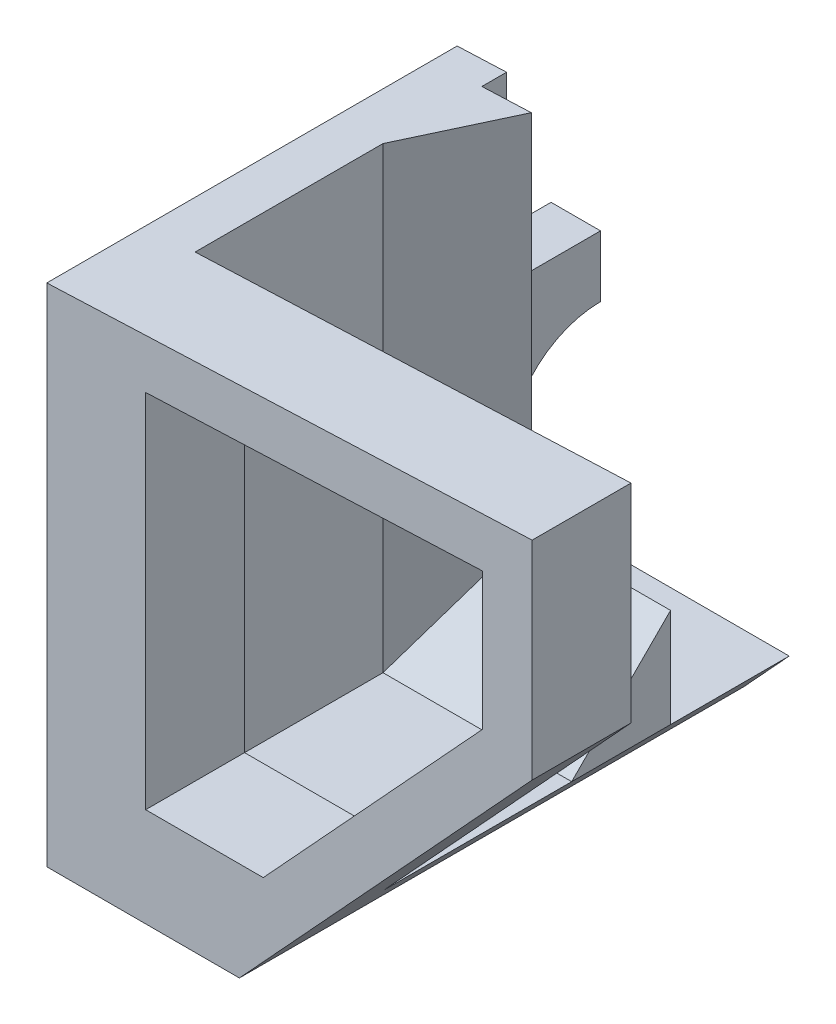
ISO-10303-21;
HEADER;
FILE_DESCRIPTION(('STEP AP214'),'2;1');
FILE_NAME('part.step','',(''),(''),'','','');
FILE_SCHEMA(('AUTOMOTIVE_DESIGN { 1 0 10303 214 1 1 1 1 }'));
ENDSEC;
DATA;
#1=APPLICATION_CONTEXT('core data for automotive mechanical design processes');
#2=APPLICATION_PROTOCOL_DEFINITION('international standard','automotive_design',2000,#1);
#3=PRODUCT_CONTEXT('',#1,'mechanical');
#4=PRODUCT('Part','Part','',(#3));
#5=PRODUCT_RELATED_PRODUCT_CATEGORY('part','',(#4));
#6=PRODUCT_DEFINITION_FORMATION('','',#4);
#7=PRODUCT_DEFINITION_CONTEXT('part definition',#1,'design');
#8=PRODUCT_DEFINITION('design','',#6,#7);
#9=PRODUCT_DEFINITION_SHAPE('','',#8);
#10=(LENGTH_UNIT() NAMED_UNIT(*) SI_UNIT(.MILLI.,.METRE.));
#11=(NAMED_UNIT(*) PLANE_ANGLE_UNIT() SI_UNIT($,.RADIAN.));
#12=(NAMED_UNIT(*) SI_UNIT($,.STERADIAN.) SOLID_ANGLE_UNIT());
#13=UNCERTAINTY_MEASURE_WITH_UNIT(LENGTH_MEASURE(1.E-05),#10,'distance_accuracy_value','');
#14=(GEOMETRIC_REPRESENTATION_CONTEXT(3) GLOBAL_UNCERTAINTY_ASSIGNED_CONTEXT((#13)) GLOBAL_UNIT_ASSIGNED_CONTEXT((#10,
#11,#12)) REPRESENTATION_CONTEXT('',''));
#15=CARTESIAN_POINT('',(0.,0.,0.));
#16=DIRECTION('',(0.,0.,1.));
#17=DIRECTION('',(1.,0.,0.));
#18=AXIS2_PLACEMENT_3D('',#15,#16,#17);
#19=CARTESIAN_POINT('',(0.,0.,-41.));
#20=DIRECTION('',(-1.,0.,0.));
#21=DIRECTION('',(0.,-1.,0.));
#22=AXIS2_PLACEMENT_3D('',#19,#20,#21);
#23=PLANE('',#22);
#24=DIRECTION('',(0.,-1.,0.));
#25=VECTOR('',#24,1.);
#26=CARTESIAN_POINT('',(0.,0.,-29.));
#27=LINE('',#26,#25);
#28=CARTESIAN_POINT('',(0.,0.,-29.));
#29=VERTEX_POINT('',#28);
#30=CARTESIAN_POINT('',(0.,-46.3445596055904,-29.));
#31=VERTEX_POINT('',#30);
#32=EDGE_CURVE('E263',#29,#31,#27,.T.);
#33=ORIENTED_EDGE('',*,*,#32,.T.);
#34=DIRECTION('',(0.,0.,1.));
#35=VECTOR('',#34,1.);
#36=CARTESIAN_POINT('',(0.,-46.3445596055904,-41.));
#37=LINE('',#36,#35);
#38=CARTESIAN_POINT('',(0.,-46.3445596055904,-41.));
#39=VERTEX_POINT('',#38);
#40=EDGE_CURVE('E207',#39,#31,#37,.T.);
#41=ORIENTED_EDGE('',*,*,#40,.F.);
#42=DIRECTION('',(0.,-1.,0.));
#43=VECTOR('',#42,1.);
#44=CARTESIAN_POINT('',(0.,0.,-41.));
#45=LINE('',#44,#43);
#46=CARTESIAN_POINT('',(0.,-43.8445596055905,-41.));
#47=VERTEX_POINT('',#46);
#48=EDGE_CURVE('E334',#47,#39,#45,.T.);
#49=ORIENTED_EDGE('',*,*,#48,.F.);
#50=CARTESIAN_POINT('',(0.,-34.3445596055904,-41.));
#51=DIRECTION('',(1.,0.,0.));
#52=DIRECTION('',(0.,1.,0.));
#53=AXIS2_PLACEMENT_3D('',#50,#51,#52);
#54=CIRCLE('',#53,9.5);
#55=CARTESIAN_POINT('',(0.,-24.8445596055904,-41.));
#56=VERTEX_POINT('',#55);
#57=EDGE_CURVE('E313',#56,#47,#54,.T.);
#58=ORIENTED_EDGE('',*,*,#57,.F.);
#59=CARTESIAN_POINT('',(0.,-18.6445596055905,-41.));
#60=VERTEX_POINT('',#59);
#61=EDGE_CURVE('E336',#60,#56,#45,.T.);
#62=ORIENTED_EDGE('',*,*,#61,.F.);
#63=DIRECTION('',(0.,0.,-1.));
#64=VECTOR('',#63,1.);
#65=CARTESIAN_POINT('',(0.,-18.6445596055905,-41.));
#66=LINE('',#65,#64);
#67=CARTESIAN_POINT('',(0.,-18.6445596055905,-31.5));
#68=VERTEX_POINT('',#67);
#69=EDGE_CURVE('E325',#68,#60,#66,.T.);
#70=ORIENTED_EDGE('',*,*,#69,.F.);
#71=DIRECTION('',(0.,-1.,0.));
#72=VECTOR('',#71,1.);
#73=CARTESIAN_POINT('',(0.,0.,-31.5));
#74=LINE('',#73,#72);
#75=CARTESIAN_POINT('',(0.,0.,-31.5));
#76=VERTEX_POINT('',#75);
#77=EDGE_CURVE('E322',#76,#68,#74,.T.);
#78=ORIENTED_EDGE('',*,*,#77,.F.);
#79=DIRECTION('',(0.,0.,1.));
#80=VECTOR('',#79,1.);
#81=CARTESIAN_POINT('',(0.,0.,-41.));
#82=LINE('',#81,#80);
#83=EDGE_CURVE('E218',#76,#29,#82,.T.);
#84=ORIENTED_EDGE('',*,*,#83,.T.);
#85=EDGE_LOOP('',(#33,#41,#49,#58,#62,#70,#78,#84));
#86=FACE_BOUND('',#85,.T.);
#87=ADVANCED_FACE('F35',(#86),#23,.F.);
#88=CARTESIAN_POINT('',(0.,-46.3445596055904,-41.));
#89=DIRECTION('',(0.,1.,0.));
#90=DIRECTION('',(-1.,0.,0.));
#91=AXIS2_PLACEMENT_3D('',#88,#89,#90);
#92=PLANE('',#91);
#93=ORIENTED_EDGE('',*,*,#40,.T.);
#94=DIRECTION('',(1.,0.,0.));
#95=VECTOR('',#94,1.);
#96=CARTESIAN_POINT('',(19.0837304644437,-46.3445596055905,-29.));
#97=LINE('',#96,#95);
#98=CARTESIAN_POINT('',(19.0837304644437,-46.3445596055905,-29.));
#99=VERTEX_POINT('',#98);
#100=EDGE_CURVE('E185',#31,#99,#97,.T.);
#101=ORIENTED_EDGE('',*,*,#100,.T.);
#102=DIRECTION('',(0.,0.,1.));
#103=VECTOR('',#102,1.);
#104=CARTESIAN_POINT('',(19.0837304644437,-46.3445596055905,-41.));
#105=LINE('',#104,#103);
#106=CARTESIAN_POINT('',(19.0837304644437,-46.3445596055905,-41.));
#107=VERTEX_POINT('',#106);
#108=EDGE_CURVE('E208',#107,#99,#105,.T.);
#109=ORIENTED_EDGE('',*,*,#108,.F.);
#110=DIRECTION('',(-1.,0.,0.));
#111=VECTOR('',#110,1.);
#112=CARTESIAN_POINT('',(0.,-46.3445596055904,-41.));
#113=LINE('',#112,#111);
#114=EDGE_CURVE('E347',#107,#39,#113,.T.);
#115=ORIENTED_EDGE('',*,*,#114,.T.);
#116=EDGE_LOOP('',(#93,#101,#109,#115));
#117=FACE_BOUND('',#116,.T.);
#118=ADVANCED_FACE('F360',(#117),#92,.T.);
#119=CARTESIAN_POINT('',(0.,0.,-41.));
#120=DIRECTION('',(0.,0.,1.));
#121=DIRECTION('',(1.,0.,0.));
#122=AXIS2_PLACEMENT_3D('',#119,#120,#121);
#123=PLANE('',#122);
#124=DIRECTION('',(0.,1.,0.));
#125=VECTOR('',#124,1.);
#126=CARTESIAN_POINT('',(-4.99999999999999,0.,-41.));
#127=LINE('',#126,#125);
#128=CARTESIAN_POINT('',(-4.99999999999999,-51.3445596055904,-41.));
#129=VERTEX_POINT('',#128);
#130=CARTESIAN_POINT('',(-4.99999999999999,-43.8445596055905,-41.));
#131=VERTEX_POINT('',#130);
#132=EDGE_CURVE('E337',#129,#131,#127,.T.);
#133=ORIENTED_EDGE('',*,*,#132,.T.);
#134=DIRECTION('',(1.,0.,0.));
#135=VECTOR('',#134,1.);
#136=CARTESIAN_POINT('',(-5.001,-43.8445596055905,-41.));
#137=LINE('',#136,#135);
#138=EDGE_CURVE('E310',#47,#131,#137,.F.);
#139=ORIENTED_EDGE('',*,*,#138,.F.);
#140=ORIENTED_EDGE('',*,*,#48,.T.);
#141=ORIENTED_EDGE('',*,*,#114,.F.);
#142=DIRECTION('',(-0.677520829933806,-0.735503585991127,0.));
#143=VECTOR('',#142,1.);
#144=CARTESIAN_POINT('',(33.4180148678653,-30.7835360687004,-41.));
#145=LINE('',#144,#143);
#146=CARTESIAN_POINT('',(14.4779009155584,-51.3445596055904,-41.));
#147=VERTEX_POINT('',#146);
#148=EDGE_CURVE('E344',#107,#147,#145,.T.);
#149=ORIENTED_EDGE('',*,*,#148,.T.);
#150=DIRECTION('',(1.,0.,0.));
#151=VECTOR('',#150,1.);
#152=CARTESIAN_POINT('',(0.,-51.3445596055904,-41.));
#153=LINE('',#152,#151);
#154=EDGE_CURVE('E340',#129,#147,#153,.T.);
#155=ORIENTED_EDGE('',*,*,#154,.F.);
#156=EDGE_LOOP('',(#133,#139,#140,#141,#149,#155));
#157=FACE_BOUND('',#156,.T.);
#158=ADVANCED_FACE('F387',(#157),#123,.F.);
#159=CARTESIAN_POINT('',(-4.99999999999999,-51.3445596055904,10.));
#160=DIRECTION('',(-1.,0.,0.));
#161=DIRECTION('',(0.,0.,1.));
#162=AXIS2_PLACEMENT_3D('',#159,#160,#161);
#163=PLANE('',#162);
#164=CARTESIAN_POINT('',(-4.99999999999999,-34.3445596055904,-41.));
#165=DIRECTION('',(-1.,0.,0.));
#166=DIRECTION('',(0.,0.,1.));
#167=AXIS2_PLACEMENT_3D('',#164,#165,#166);
#168=CIRCLE('',#167,9.5);
#169=CARTESIAN_POINT('',(-4.99999999999999,-24.8445596055904,-41.));
#170=VERTEX_POINT('',#169);
#171=EDGE_CURVE('E315',#170,#131,#168,.F.);
#172=ORIENTED_EDGE('',*,*,#171,.T.);
#173=ORIENTED_EDGE('',*,*,#132,.F.);
#174=DIRECTION('',(0.,0.,-1.));
#175=VECTOR('',#174,1.);
#176=CARTESIAN_POINT('',(-4.99999999999999,-51.3445596055904,10.));
#177=LINE('',#176,#175);
#178=CARTESIAN_POINT('',(-4.99999999999999,-51.3445596055904,10.));
#179=VERTEX_POINT('',#178);
#180=EDGE_CURVE('E242',#179,#129,#177,.T.);
#181=ORIENTED_EDGE('',*,*,#180,.F.);
#182=DIRECTION('',(0.,1.,0.));
#183=VECTOR('',#182,1.);
#184=CARTESIAN_POINT('',(-4.99999999999999,-51.3445596055904,10.));
#185=LINE('',#184,#183);
#186=CARTESIAN_POINT('',(-4.99999999999999,-0.205172520034776,10.));
#187=VERTEX_POINT('',#186);
#188=EDGE_CURVE('E222',#179,#187,#185,.T.);
#189=ORIENTED_EDGE('',*,*,#188,.T.);
#190=DIRECTION('',(0.,0.,-1.));
#191=VECTOR('',#190,1.);
#192=CARTESIAN_POINT('',(-4.99999999999999,-0.205172520034776,10.));
#193=LINE('',#192,#191);
#194=CARTESIAN_POINT('',(-4.99999999999999,-0.205172520034776,-31.5));
#195=VERTEX_POINT('',#194);
#196=EDGE_CURVE('E235',#187,#195,#193,.T.);
#197=ORIENTED_EDGE('',*,*,#196,.T.);
#198=DIRECTION('',(0.,-1.,0.));
#199=VECTOR('',#198,1.);
#200=CARTESIAN_POINT('',(-4.99999999999999,0.,-31.5));
#201=LINE('',#200,#199);
#202=CARTESIAN_POINT('',(-4.99999999999999,-18.6445596055905,-31.5));
#203=VERTEX_POINT('',#202);
#204=EDGE_CURVE('E311',#195,#203,#201,.T.);
#205=ORIENTED_EDGE('',*,*,#204,.T.);
#206=DIRECTION('',(0.,0.,-1.));
#207=VECTOR('',#206,1.);
#208=CARTESIAN_POINT('',(-4.99999999999999,-18.6445596055905,-41.));
#209=LINE('',#208,#207);
#210=CARTESIAN_POINT('',(-4.99999999999999,-18.6445596055905,-41.));
#211=VERTEX_POINT('',#210);
#212=EDGE_CURVE('E319',#203,#211,#209,.T.);
#213=ORIENTED_EDGE('',*,*,#212,.T.);
#214=EDGE_CURVE('E341',#170,#211,#127,.T.);
#215=ORIENTED_EDGE('',*,*,#214,.F.);
#216=EDGE_LOOP('',(#172,#173,#181,#189,#197,#205,#213,#215));
#217=FACE_BOUND('',#216,.T.);
#218=ADVANCED_FACE('F391',(#217),#163,.T.);
#219=CARTESIAN_POINT('',(-4.99999999999999,-51.3445596055904,10.));
#220=DIRECTION('',(0.,1.,0.));
#221=DIRECTION('',(-1.,0.,0.));
#222=AXIS2_PLACEMENT_3D('',#219,#220,#221);
#223=PLANE('',#222);
#224=ORIENTED_EDGE('',*,*,#180,.T.);
#225=ORIENTED_EDGE('',*,*,#154,.T.);
#226=DIRECTION('',(0.,0.,-1.));
#227=VECTOR('',#226,1.);
#228=CARTESIAN_POINT('',(14.4779009155584,-51.3445596055904,10.));
#229=LINE('',#228,#227);
#230=CARTESIAN_POINT('',(14.4779009155584,-51.3445596055904,10.));
#231=VERTEX_POINT('',#230);
#232=EDGE_CURVE('E244',#231,#147,#229,.T.);
#233=ORIENTED_EDGE('',*,*,#232,.F.);
#234=DIRECTION('',(1.,0.,0.));
#235=VECTOR('',#234,1.);
#236=CARTESIAN_POINT('',(-4.99999999999999,-51.3445596055904,10.));
#237=LINE('',#236,#235);
#238=EDGE_CURVE('E233',#179,#231,#237,.T.);
#239=ORIENTED_EDGE('',*,*,#238,.F.);
#240=EDGE_LOOP('',(#224,#225,#233,#239));
#241=FACE_BOUND('',#240,.T.);
#242=ADVANCED_FACE('F388',(#241),#223,.F.);
#243=CARTESIAN_POINT('',(44.0837304644437,-19.2050402913656,10.));
#244=DIRECTION('',(0.735503585991127,-0.677520829933806,0.));
#245=DIRECTION('',(0.677520829933806,0.735503585991127,0.));
#246=AXIS2_PLACEMENT_3D('',#243,#244,#245);
#247=PLANE('',#246);
#248=DIRECTION('',(-0.677520829933806,-0.735503585991127,0.));
#249=VECTOR('',#248,1.);
#250=CARTESIAN_POINT('',(44.0837304644437,-19.2050402913656,0.));
#251=LINE('',#250,#249);
#252=CARTESIAN_POINT('',(44.0837304644437,-19.2050402913656,0.));
#253=VERTEX_POINT('',#252);
#254=CARTESIAN_POINT('',(19.0837304644437,-46.3445596055905,0.));
#255=VERTEX_POINT('',#254);
#256=EDGE_CURVE('E226',#253,#255,#251,.T.);
#257=ORIENTED_EDGE('',*,*,#256,.F.);
#258=DIRECTION('',(0.,0.,-1.));
#259=VECTOR('',#258,1.);
#260=CARTESIAN_POINT('',(44.0837304644437,-19.2050402913656,10.));
#261=LINE('',#260,#259);
#262=CARTESIAN_POINT('',(44.0837304644437,-19.2050402913656,10.));
#263=VERTEX_POINT('',#262);
#264=EDGE_CURVE('E246',#263,#253,#261,.T.);
#265=ORIENTED_EDGE('',*,*,#264,.F.);
#266=DIRECTION('',(-0.677520829933806,-0.735503585991127,0.));
#267=VECTOR('',#266,1.);
#268=CARTESIAN_POINT('',(44.0837304644437,-19.2050402913656,10.));
#269=LINE('',#268,#267);
#270=EDGE_CURVE('E230',#263,#231,#269,.T.);
#271=ORIENTED_EDGE('',*,*,#270,.T.);
#272=ORIENTED_EDGE('',*,*,#232,.T.);
#273=ORIENTED_EDGE('',*,*,#148,.F.);
#274=ORIENTED_EDGE('',*,*,#108,.T.);
#275=DIRECTION('',(0.,0.,-1.));
#276=VECTOR('',#275,1.);
#277=CARTESIAN_POINT('',(19.0837304644437,-46.3445596055905,-19.));
#278=LINE('',#277,#276);
#279=CARTESIAN_POINT('',(19.0837304644437,-46.3445596055905,-19.));
#280=VERTEX_POINT('',#279);
#281=EDGE_CURVE('E201',#280,#99,#278,.T.);
#282=ORIENTED_EDGE('',*,*,#281,.F.);
#283=EDGE_CURVE('E199',#280,#255,#105,.T.);
#284=ORIENTED_EDGE('',*,*,#283,.T.);
#285=EDGE_LOOP('',(#257,#265,#271,#272,#273,#274,#282,#284));
#286=FACE_BOUND('',#285,.T.);
#287=ADVANCED_FACE('F355',(#286),#247,.T.);
#288=CARTESIAN_POINT('',(44.0837304644437,-19.2050402913656,10.));
#289=DIRECTION('',(-1.,0.,0.));
#290=DIRECTION('',(0.,0.,1.));
#291=AXIS2_PLACEMENT_3D('',#288,#289,#290);
#292=PLANE('',#291);
#293=DIRECTION('',(0.,1.,0.));
#294=VECTOR('',#293,1.);
#295=CARTESIAN_POINT('',(44.0837304644437,-19.2050402913656,0.));
#296=LINE('',#295,#294);
#297=CARTESIAN_POINT('',(44.0837304644437,1.80895401438478,0.));
#298=VERTEX_POINT('',#297);
#299=EDGE_CURVE('E238',#253,#298,#296,.T.);
#300=ORIENTED_EDGE('',*,*,#299,.T.);
#301=DIRECTION('',(0.,0.,-1.));
#302=VECTOR('',#301,1.);
#303=CARTESIAN_POINT('',(44.0837304644437,1.80895401438478,10.));
#304=LINE('',#303,#302);
#305=CARTESIAN_POINT('',(44.0837304644437,1.80895401438478,10.));
#306=VERTEX_POINT('',#305);
#307=EDGE_CURVE('E248',#306,#298,#304,.T.);
#308=ORIENTED_EDGE('',*,*,#307,.F.);
#309=DIRECTION('',(0.,1.,0.));
#310=VECTOR('',#309,1.);
#311=CARTESIAN_POINT('',(44.0837304644437,-19.2050402913656,10.));
#312=LINE('',#311,#310);
#313=EDGE_CURVE('E228',#263,#306,#312,.T.);
#314=ORIENTED_EDGE('',*,*,#313,.F.);
#315=ORIENTED_EDGE('',*,*,#264,.T.);
#316=EDGE_LOOP('',(#300,#308,#314,#315));
#317=FACE_BOUND('',#316,.T.);
#318=ADVANCED_FACE('F377',(#317),#292,.F.);
#319=CARTESIAN_POINT('',(44.0837304644437,1.80895401438478,10.));
#320=DIRECTION('',(0.0409999999999302,-0.999159146482684,0.));
#321=DIRECTION('',(0.999159146482684,0.0409999999999302,0.));
#322=AXIS2_PLACEMENT_3D('',#319,#320,#321);
#323=PLANE('',#322);
#324=CARTESIAN_POINT('',(0.,0.,-19.));
#325=VERTEX_POINT('',#324);
#326=CARTESIAN_POINT('',(0.,0.,0.));
#327=VERTEX_POINT('',#326);
#328=EDGE_CURVE('E221',#325,#327,#82,.T.);
#329=ORIENTED_EDGE('',*,*,#328,.F.);
#330=DIRECTION('',(0.447138311324226,0.0183480988276974,-0.894276622648456));
#331=VECTOR('',#330,1.);
#332=CARTESIAN_POINT('',(0.,0.,-19.));
#333=LINE('',#332,#331);
#334=CARTESIAN_POINT('',(5.,0.205172520034783,-29.));
#335=VERTEX_POINT('',#334);
#336=EDGE_CURVE('E175',#325,#335,#333,.T.);
#337=ORIENTED_EDGE('',*,*,#336,.T.);
#338=DIRECTION('',(-0.999159146482684,-0.0409999999999303,0.));
#339=VECTOR('',#338,1.);
#340=CARTESIAN_POINT('',(0.,0.,-29.));
#341=LINE('',#340,#339);
#342=EDGE_CURVE('E261',#335,#29,#341,.T.);
#343=ORIENTED_EDGE('',*,*,#342,.T.);
#344=ORIENTED_EDGE('',*,*,#83,.F.);
#345=DIRECTION('',(0.999159146482684,0.0409999999999302,0.));
#346=VECTOR('',#345,1.);
#347=CARTESIAN_POINT('',(-4.99259331900003,-0.204868590553604,-31.5));
#348=LINE('',#347,#346);
#349=EDGE_CURVE('E307',#195,#76,#348,.T.);
#350=ORIENTED_EDGE('',*,*,#349,.F.);
#351=ORIENTED_EDGE('',*,*,#196,.F.);
#352=DIRECTION('',(-0.999159146482684,-0.0409999999999302,0.));
#353=VECTOR('',#352,1.);
#354=CARTESIAN_POINT('',(44.0837304644437,1.80895401438478,10.));
#355=LINE('',#354,#353);
#356=EDGE_CURVE('E225',#306,#187,#355,.T.);
#357=ORIENTED_EDGE('',*,*,#356,.F.);
#358=ORIENTED_EDGE('',*,*,#307,.T.);
#359=DIRECTION('',(-0.999159146482684,-0.0409999999999302,0.));
#360=VECTOR('',#359,1.);
#361=CARTESIAN_POINT('',(44.0837304644437,1.80895401438478,0.));
#362=LINE('',#361,#360);
#363=EDGE_CURVE('E211',#298,#327,#362,.T.);
#364=ORIENTED_EDGE('',*,*,#363,.T.);
#365=EDGE_LOOP('',(#329,#337,#343,#344,#350,#351,#357,#358,#364));
#366=FACE_BOUND('',#365,.T.);
#367=ADVANCED_FACE('F372',(#366),#323,.F.);
#368=CARTESIAN_POINT('',(0.,0.,10.));
#369=DIRECTION('',(0.,0.,-1.));
#370=DIRECTION('',(-1.,0.,0.));
#371=AXIS2_PLACEMENT_3D('',#368,#369,#370);
#372=PLANE('',#371);
#373=DIRECTION('',(-0.999159146482684,-0.0409999999999302,0.));
#374=VECTOR('',#373,1.);
#375=CARTESIAN_POINT('',(5.,-4.79903528570005,10.));
#376=LINE('',#375,#374);
#377=CARTESIAN_POINT('',(39.0837304644437,-3.40042631138484,10.));
#378=VERTEX_POINT('',#377);
#379=CARTESIAN_POINT('',(5.,-4.79903528570005,10.));
#380=VERTEX_POINT('',#379);
#381=EDGE_CURVE('E273',#378,#380,#376,.T.);
#382=ORIENTED_EDGE('',*,*,#381,.F.);
#383=DIRECTION('',(0.,1.,0.));
#384=VECTOR('',#383,1.);
#385=CARTESIAN_POINT('',(39.0837304644437,-3.40042631138484,10.));
#386=LINE('',#385,#384);
#387=CARTESIAN_POINT('',(39.0837304644437,-17.253097249004,10.));
#388=VERTEX_POINT('',#387);
#389=EDGE_CURVE('E276',#388,#378,#386,.T.);
#390=ORIENTED_EDGE('',*,*,#389,.F.);
#391=DIRECTION('',(0.677520829933806,0.735503585991127,0.));
#392=VECTOR('',#391,1.);
#393=CARTESIAN_POINT('',(39.0837304644437,-17.253097249004,10.));
#394=LINE('',#393,#392);
#395=CARTESIAN_POINT('',(16.891496624879,-41.3445596055905,10.));
#396=VERTEX_POINT('',#395);
#397=EDGE_CURVE('E296',#396,#388,#394,.T.);
#398=ORIENTED_EDGE('',*,*,#397,.F.);
#399=DIRECTION('',(1.,0.,0.));
#400=VECTOR('',#399,1.);
#401=CARTESIAN_POINT('',(16.891496624879,-41.3445596055905,10.));
#402=LINE('',#401,#400);
#403=CARTESIAN_POINT('',(5.,-41.3445596055904,10.));
#404=VERTEX_POINT('',#403);
#405=EDGE_CURVE('E268',#404,#396,#402,.T.);
#406=ORIENTED_EDGE('',*,*,#405,.F.);
#407=DIRECTION('',(0.,-1.,0.));
#408=VECTOR('',#407,1.);
#409=CARTESIAN_POINT('',(5.,-41.3445596055904,10.));
#410=LINE('',#409,#408);
#411=EDGE_CURVE('E270',#380,#404,#410,.T.);
#412=ORIENTED_EDGE('',*,*,#411,.F.);
#413=EDGE_LOOP('',(#382,#390,#398,#406,#412));
#414=FACE_BOUND('',#413,.T.);
#415=ORIENTED_EDGE('',*,*,#188,.F.);
#416=ORIENTED_EDGE('',*,*,#238,.T.);
#417=ORIENTED_EDGE('',*,*,#270,.F.);
#418=ORIENTED_EDGE('',*,*,#313,.T.);
#419=ORIENTED_EDGE('',*,*,#356,.T.);
#420=EDGE_LOOP('',(#415,#416,#417,#418,#419));
#421=FACE_BOUND('',#420,.T.);
#422=ADVANCED_FACE('F381',(#414,#421),#372,.F.);
#423=CARTESIAN_POINT('',(0.,0.,0.));
#424=DIRECTION('',(0.,0.,-1.));
#425=DIRECTION('',(-1.,0.,0.));
#426=AXIS2_PLACEMENT_3D('',#423,#424,#425);
#427=PLANE('',#426);
#428=DIRECTION('',(0.,-1.,0.));
#429=VECTOR('',#428,1.);
#430=CARTESIAN_POINT('',(39.0837304644437,-3.40042631138484,0.));
#431=LINE('',#430,#429);
#432=CARTESIAN_POINT('',(39.0837304644437,-3.40042631138484,0.));
#433=VERTEX_POINT('',#432);
#434=CARTESIAN_POINT('',(39.0837304644437,-17.253097249004,0.));
#435=VERTEX_POINT('',#434);
#436=EDGE_CURVE('E279',#433,#435,#431,.T.);
#437=ORIENTED_EDGE('',*,*,#436,.F.);
#438=DIRECTION('',(0.999159146482684,0.0409999999999302,0.));
#439=VECTOR('',#438,1.);
#440=CARTESIAN_POINT('',(5.,-4.79903528570005,0.));
#441=LINE('',#440,#439);
#442=CARTESIAN_POINT('',(5.,-4.79903528570005,0.));
#443=VERTEX_POINT('',#442);
#444=EDGE_CURVE('E290',#443,#433,#441,.T.);
#445=ORIENTED_EDGE('',*,*,#444,.F.);
#446=DIRECTION('',(0.,1.,0.));
#447=VECTOR('',#446,1.);
#448=CARTESIAN_POINT('',(5.,-41.3445596055904,0.));
#449=LINE('',#448,#447);
#450=CARTESIAN_POINT('',(5.,-41.3445596055904,0.));
#451=VERTEX_POINT('',#450);
#452=EDGE_CURVE('E287',#451,#443,#449,.T.);
#453=ORIENTED_EDGE('',*,*,#452,.F.);
#454=DIRECTION('',(-1.,0.,0.));
#455=VECTOR('',#454,1.);
#456=CARTESIAN_POINT('',(16.891496624879,-41.3445596055905,0.));
#457=LINE('',#456,#455);
#458=CARTESIAN_POINT('',(16.891496624879,-41.3445596055905,0.));
#459=VERTEX_POINT('',#458);
#460=EDGE_CURVE('E284',#459,#451,#457,.T.);
#461=ORIENTED_EDGE('',*,*,#460,.F.);
#462=DIRECTION('',(-0.677520829933806,-0.735503585991127,0.));
#463=VECTOR('',#462,1.);
#464=CARTESIAN_POINT('',(39.0837304644437,-17.253097249004,0.));
#465=LINE('',#464,#463);
#466=EDGE_CURVE('E281',#435,#459,#465,.T.);
#467=ORIENTED_EDGE('',*,*,#466,.F.);
#468=EDGE_LOOP('',(#437,#445,#453,#461,#467));
#469=FACE_BOUND('',#468,.T.);
#470=DIRECTION('',(0.,-1.,0.));
#471=VECTOR('',#470,1.);
#472=CARTESIAN_POINT('',(0.,0.,0.));
#473=LINE('',#472,#471);
#474=CARTESIAN_POINT('',(0.,-46.3445596055904,0.));
#475=VERTEX_POINT('',#474);
#476=EDGE_CURVE('E205',#327,#475,#473,.T.);
#477=ORIENTED_EDGE('',*,*,#476,.F.);
#478=ORIENTED_EDGE('',*,*,#363,.F.);
#479=ORIENTED_EDGE('',*,*,#299,.F.);
#480=ORIENTED_EDGE('',*,*,#256,.T.);
#481=DIRECTION('',(-1.,0.,0.));
#482=VECTOR('',#481,1.);
#483=CARTESIAN_POINT('',(0.,-46.3445596055904,0.));
#484=LINE('',#483,#482);
#485=EDGE_CURVE('E215',#255,#475,#484,.T.);
#486=ORIENTED_EDGE('',*,*,#485,.T.);
#487=EDGE_LOOP('',(#477,#478,#479,#480,#486));
#488=FACE_BOUND('',#487,.T.);
#489=ADVANCED_FACE('F350',(#469,#488),#427,.T.);
#490=CARTESIAN_POINT('',(0.,-46.3445596055905,-19.));
#491=VERTEX_POINT('',#490);
#492=EDGE_CURVE('E197',#491,#475,#37,.T.);
#493=ORIENTED_EDGE('',*,*,#492,.F.);
#494=DIRECTION('',(0.,-1.,0.));
#495=VECTOR('',#494,1.);
#496=CARTESIAN_POINT('',(0.,0.,-19.));
#497=LINE('',#496,#495);
#498=EDGE_CURVE('E177',#325,#491,#497,.T.);
#499=ORIENTED_EDGE('',*,*,#498,.F.);
#500=ORIENTED_EDGE('',*,*,#328,.T.);
#501=ORIENTED_EDGE('',*,*,#476,.T.);
#502=EDGE_LOOP('',(#493,#499,#500,#501));
#503=FACE_BOUND('',#502,.T.);
#504=ADVANCED_FACE('F203',(#503),#23,.F.);
#505=DIRECTION('',(1.,0.,0.));
#506=VECTOR('',#505,1.);
#507=CARTESIAN_POINT('',(19.0837304644437,-46.3445596055905,-19.));
#508=LINE('',#507,#506);
#509=EDGE_CURVE('E184',#491,#280,#508,.T.);
#510=ORIENTED_EDGE('',*,*,#509,.F.);
#511=ORIENTED_EDGE('',*,*,#492,.T.);
#512=ORIENTED_EDGE('',*,*,#485,.F.);
#513=ORIENTED_EDGE('',*,*,#283,.F.);
#514=EDGE_LOOP('',(#510,#511,#512,#513));
#515=FACE_BOUND('',#514,.T.);
#516=ADVANCED_FACE('F195',(#515),#92,.T.);
#517=ORIENTED_EDGE('',*,*,#61,.T.);
#518=DIRECTION('',(1.,0.,0.));
#519=VECTOR('',#518,1.);
#520=CARTESIAN_POINT('',(-5.001,-24.8445596055904,-41.));
#521=LINE('',#520,#519);
#522=EDGE_CURVE('E308',#170,#56,#521,.T.);
#523=ORIENTED_EDGE('',*,*,#522,.F.);
#524=ORIENTED_EDGE('',*,*,#214,.T.);
#525=DIRECTION('',(1.,0.,0.));
#526=VECTOR('',#525,1.);
#527=CARTESIAN_POINT('',(-5.001,-18.6445596055905,-41.));
#528=LINE('',#527,#526);
#529=EDGE_CURVE('E328',#211,#60,#528,.T.);
#530=ORIENTED_EDGE('',*,*,#529,.T.);
#531=EDGE_LOOP('',(#517,#523,#524,#530));
#532=FACE_BOUND('',#531,.T.);
#533=ADVANCED_FACE('F400',(#532),#123,.F.);
#534=CARTESIAN_POINT('',(-5.001,-18.6445596055905,-41.));
#535=DIRECTION('',(0.,-1.,0.));
#536=DIRECTION('',(1.,0.,0.));
#537=AXIS2_PLACEMENT_3D('',#534,#535,#536);
#538=PLANE('',#537);
#539=DIRECTION('',(1.,0.,0.));
#540=VECTOR('',#539,1.);
#541=CARTESIAN_POINT('',(-5.001,-18.6445596055905,-31.5));
#542=LINE('',#541,#540);
#543=EDGE_CURVE('E327',#203,#68,#542,.T.);
#544=ORIENTED_EDGE('',*,*,#543,.T.);
#545=ORIENTED_EDGE('',*,*,#69,.T.);
#546=ORIENTED_EDGE('',*,*,#529,.F.);
#547=ORIENTED_EDGE('',*,*,#212,.F.);
#548=EDGE_LOOP('',(#544,#545,#546,#547));
#549=FACE_BOUND('',#548,.T.);
#550=ADVANCED_FACE('F404',(#549),#538,.F.);
#551=CARTESIAN_POINT('',(-5.001,0.,-31.5));
#552=DIRECTION('',(0.,0.,1.));
#553=DIRECTION('',(1.,0.,0.));
#554=AXIS2_PLACEMENT_3D('',#551,#552,#553);
#555=PLANE('',#554);
#556=ORIENTED_EDGE('',*,*,#349,.T.);
#557=ORIENTED_EDGE('',*,*,#77,.T.);
#558=ORIENTED_EDGE('',*,*,#543,.F.);
#559=ORIENTED_EDGE('',*,*,#204,.F.);
#560=EDGE_LOOP('',(#556,#557,#558,#559));
#561=FACE_BOUND('',#560,.T.);
#562=ADVANCED_FACE('F406',(#561),#555,.F.);
#563=CARTESIAN_POINT('',(-5.001,-34.3445596055904,-41.));
#564=DIRECTION('',(1.,0.,0.));
#565=DIRECTION('',(0.,1.,0.));
#566=AXIS2_PLACEMENT_3D('',#563,#564,#565);
#567=CYLINDRICAL_SURFACE('',#566,9.5);
#568=ORIENTED_EDGE('',*,*,#138,.T.);
#569=ORIENTED_EDGE('',*,*,#171,.F.);
#570=ORIENTED_EDGE('',*,*,#522,.T.);
#571=ORIENTED_EDGE('',*,*,#57,.T.);
#572=EDGE_LOOP('',(#568,#569,#570,#571));
#573=FACE_BOUND('',#572,.T.);
#574=ADVANCED_FACE('F408',(#573),#567,.F.);
#575=CARTESIAN_POINT('',(39.0837304644437,-3.40042631138484,10.001));
#576=DIRECTION('',(1.,0.,0.));
#577=DIRECTION('',(0.,0.,-1.));
#578=AXIS2_PLACEMENT_3D('',#575,#576,#577);
#579=PLANE('',#578);
#580=ORIENTED_EDGE('',*,*,#389,.T.);
#581=DIRECTION('',(0.,0.,-1.));
#582=VECTOR('',#581,1.);
#583=CARTESIAN_POINT('',(39.0837304644437,-3.40042631138484,10.001));
#584=LINE('',#583,#582);
#585=EDGE_CURVE('E294',#378,#433,#584,.T.);
#586=ORIENTED_EDGE('',*,*,#585,.T.);
#587=ORIENTED_EDGE('',*,*,#436,.T.);
#588=DIRECTION('',(0.,0.,-1.));
#589=VECTOR('',#588,1.);
#590=CARTESIAN_POINT('',(39.0837304644437,-17.253097249004,10.001));
#591=LINE('',#590,#589);
#592=EDGE_CURVE('E293',#388,#435,#591,.T.);
#593=ORIENTED_EDGE('',*,*,#592,.F.);
#594=EDGE_LOOP('',(#580,#586,#587,#593));
#595=FACE_BOUND('',#594,.T.);
#596=ADVANCED_FACE('F414',(#595),#579,.F.);
#597=CARTESIAN_POINT('',(5.,-4.79903528570005,10.001));
#598=DIRECTION('',(-0.0409999999999302,0.999159146482684,0.));
#599=DIRECTION('',(-0.999159146482684,-0.0409999999999302,0.));
#600=AXIS2_PLACEMENT_3D('',#597,#598,#599);
#601=PLANE('',#600);
#602=ORIENTED_EDGE('',*,*,#381,.T.);
#603=DIRECTION('',(0.,0.,-1.));
#604=VECTOR('',#603,1.);
#605=CARTESIAN_POINT('',(5.,-4.79903528570005,10.001));
#606=LINE('',#605,#604);
#607=EDGE_CURVE('E297',#380,#443,#606,.T.);
#608=ORIENTED_EDGE('',*,*,#607,.T.);
#609=ORIENTED_EDGE('',*,*,#444,.T.);
#610=ORIENTED_EDGE('',*,*,#585,.F.);
#611=EDGE_LOOP('',(#602,#608,#609,#610));
#612=FACE_BOUND('',#611,.T.);
#613=ADVANCED_FACE('F459',(#612),#601,.F.);
#614=CARTESIAN_POINT('',(5.,-41.3445596055904,10.001));
#615=DIRECTION('',(-1.,0.,0.));
#616=DIRECTION('',(0.,-1.,0.));
#617=AXIS2_PLACEMENT_3D('',#614,#615,#616);
#618=PLANE('',#617);
#619=ORIENTED_EDGE('',*,*,#411,.T.);
#620=DIRECTION('',(0.,0.,-1.));
#621=VECTOR('',#620,1.);
#622=CARTESIAN_POINT('',(5.,-41.3445596055904,10.001));
#623=LINE('',#622,#621);
#624=EDGE_CURVE('E299',#404,#451,#623,.T.);
#625=ORIENTED_EDGE('',*,*,#624,.T.);
#626=ORIENTED_EDGE('',*,*,#452,.T.);
#627=ORIENTED_EDGE('',*,*,#607,.F.);
#628=EDGE_LOOP('',(#619,#625,#626,#627));
#629=FACE_BOUND('',#628,.T.);
#630=ADVANCED_FACE('F462',(#629),#618,.F.);
#631=CARTESIAN_POINT('',(16.891496624879,-41.3445596055905,10.001));
#632=DIRECTION('',(0.,-1.,0.));
#633=DIRECTION('',(1.,0.,0.));
#634=AXIS2_PLACEMENT_3D('',#631,#632,#633);
#635=PLANE('',#634);
#636=ORIENTED_EDGE('',*,*,#405,.T.);
#637=DIRECTION('',(0.,0.,-1.));
#638=VECTOR('',#637,1.);
#639=CARTESIAN_POINT('',(16.891496624879,-41.3445596055905,10.001));
#640=LINE('',#639,#638);
#641=EDGE_CURVE('E301',#396,#459,#640,.T.);
#642=ORIENTED_EDGE('',*,*,#641,.T.);
#643=ORIENTED_EDGE('',*,*,#460,.T.);
#644=ORIENTED_EDGE('',*,*,#624,.F.);
#645=EDGE_LOOP('',(#636,#642,#643,#644));
#646=FACE_BOUND('',#645,.T.);
#647=ADVANCED_FACE('F466',(#646),#635,.F.);
#648=CARTESIAN_POINT('',(39.0837304644437,-17.253097249004,10.001));
#649=DIRECTION('',(0.735503585991127,-0.677520829933806,0.));
#650=DIRECTION('',(0.677520829933806,0.735503585991127,0.));
#651=AXIS2_PLACEMENT_3D('',#648,#649,#650);
#652=PLANE('',#651);
#653=ORIENTED_EDGE('',*,*,#397,.T.);
#654=ORIENTED_EDGE('',*,*,#592,.T.);
#655=ORIENTED_EDGE('',*,*,#466,.T.);
#656=ORIENTED_EDGE('',*,*,#641,.F.);
#657=EDGE_LOOP('',(#653,#654,#655,#656));
#658=FACE_BOUND('',#657,.T.);
#659=ADVANCED_FACE('F456',(#658),#652,.F.);
#660=CARTESIAN_POINT('',(19.0837304644437,-46.3445596055905,-19.));
#661=DIRECTION('',(-1.,0.,0.));
#662=DIRECTION('',(0.,0.,1.));
#663=AXIS2_PLACEMENT_3D('',#660,#661,#662);
#664=PLANE('',#663);
#665=DIRECTION('',(0.,1.,0.));
#666=VECTOR('',#665,1.);
#667=CARTESIAN_POINT('',(19.0837304644437,-46.3445596055905,-29.));
#668=LINE('',#667,#666);
#669=CARTESIAN_POINT('',(19.0837304644437,-36.3445596055905,-29.));
#670=VERTEX_POINT('',#669);
#671=EDGE_CURVE('E51',#99,#670,#668,.T.);
#672=ORIENTED_EDGE('',*,*,#671,.T.);
#673=DIRECTION('',(0.,-0.707106781186546,0.707106781186549));
#674=VECTOR('',#673,1.);
#675=CARTESIAN_POINT('',(19.0837304644437,-46.3445596055905,-19.));
#676=LINE('',#675,#674);
#677=EDGE_CURVE('E44',#670,#280,#676,.T.);
#678=ORIENTED_EDGE('',*,*,#677,.T.);
#679=ORIENTED_EDGE('',*,*,#281,.T.);
#680=EDGE_LOOP('',(#672,#678,#679));
#681=FACE_BOUND('',#680,.T.);
#682=ADVANCED_FACE('F254',(#681),#664,.F.);
#683=CARTESIAN_POINT('',(0.,0.,-29.));
#684=DIRECTION('',(0.,0.,1.));
#685=DIRECTION('',(1.,0.,0.));
#686=AXIS2_PLACEMENT_3D('',#683,#684,#685);
#687=PLANE('',#686);
#688=ORIENTED_EDGE('',*,*,#671,.F.);
#689=ORIENTED_EDGE('',*,*,#100,.F.);
#690=ORIENTED_EDGE('',*,*,#32,.F.);
#691=ORIENTED_EDGE('',*,*,#342,.F.);
#692=DIRECTION('',(0.,1.,0.));
#693=VECTOR('',#692,1.);
#694=CARTESIAN_POINT('',(5.,-36.3445596055905,-29.));
#695=LINE('',#694,#693);
#696=CARTESIAN_POINT('',(5.,-36.3445596055905,-29.));
#697=VERTEX_POINT('',#696);
#698=EDGE_CURVE('E257',#697,#335,#695,.T.);
#699=ORIENTED_EDGE('',*,*,#698,.F.);
#700=DIRECTION('',(-1.,0.,0.));
#701=VECTOR('',#700,1.);
#702=CARTESIAN_POINT('',(19.0837304644437,-36.3445596055905,-29.));
#703=LINE('',#702,#701);
#704=EDGE_CURVE('E192',#670,#697,#703,.T.);
#705=ORIENTED_EDGE('',*,*,#704,.F.);
#706=EDGE_LOOP('',(#688,#689,#690,#691,#699,#705));
#707=FACE_BOUND('',#706,.T.);
#708=ADVANCED_FACE('F363',(#707),#687,.F.);
#709=CARTESIAN_POINT('',(0.,0.,-19.));
#710=DIRECTION('',(0.894427190999917,0.,0.447213595499956));
#711=DIRECTION('',(0.,-1.,0.));
#712=AXIS2_PLACEMENT_3D('',#709,#710,#711);
#713=PLANE('',#712);
#714=ORIENTED_EDGE('',*,*,#498,.T.);
#715=DIRECTION('',(0.333333333333332,0.666666666666666,-0.666666666666668));
#716=VECTOR('',#715,1.);
#717=CARTESIAN_POINT('',(0.,-46.3445596055905,-19.));
#718=LINE('',#717,#716);
#719=EDGE_CURVE('E11',#491,#697,#718,.T.);
#720=ORIENTED_EDGE('',*,*,#719,.T.);
#721=ORIENTED_EDGE('',*,*,#698,.T.);
#722=ORIENTED_EDGE('',*,*,#336,.F.);
#723=EDGE_LOOP('',(#714,#720,#721,#722));
#724=FACE_BOUND('',#723,.T.);
#725=ADVANCED_FACE('F179',(#724),#713,.T.);
#726=CARTESIAN_POINT('',(0.,-46.3445596055905,-19.));
#727=DIRECTION('',(0.,0.707106781186549,0.707106781186546));
#728=DIRECTION('',(1.,0.,0.));
#729=AXIS2_PLACEMENT_3D('',#726,#727,#728);
#730=PLANE('',#729);
#731=ORIENTED_EDGE('',*,*,#677,.F.);
#732=ORIENTED_EDGE('',*,*,#704,.T.);
#733=ORIENTED_EDGE('',*,*,#719,.F.);
#734=ORIENTED_EDGE('',*,*,#509,.T.);
#735=EDGE_LOOP('',(#731,#732,#733,#734));
#736=FACE_BOUND('',#735,.T.);
#737=ADVANCED_FACE('F37',(#736),#730,.T.);
#738=CLOSED_SHELL('',(#87,#118,#158,#218,#242,#287,#318,#367,#422,#489,#504,#516,#533,#550,#562,
#574,#596,#613,#630,#647,#659,#682,#708,#725,#737));
#739=MANIFOLD_SOLID_BREP('B2',#738);
#740=ADVANCED_BREP_SHAPE_REPRESENTATION('',(#18,#739),#14);
#741=SHAPE_DEFINITION_REPRESENTATION(#9,#740);
ENDSEC;
END-ISO-10303-21;
